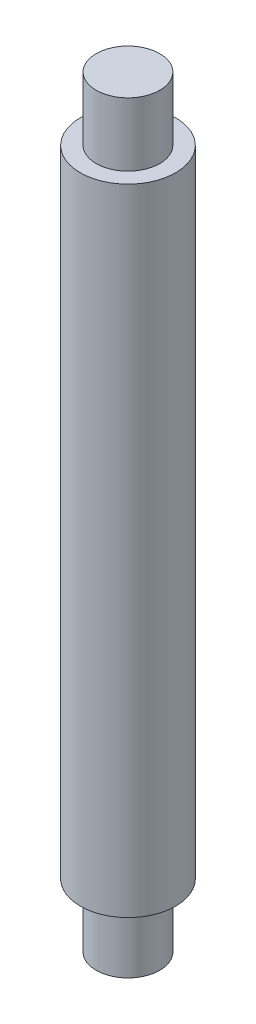
ISO-10303-21;
HEADER;
FILE_DESCRIPTION(('STEP AP214'),'2;1');
FILE_NAME('part.step','',(''),(''),'','','');
FILE_SCHEMA(('AUTOMOTIVE_DESIGN { 1 0 10303 214 1 1 1 1 }'));
ENDSEC;
DATA;
#1=APPLICATION_CONTEXT('core data for automotive mechanical design processes');
#2=APPLICATION_PROTOCOL_DEFINITION('international standard','automotive_design',2000,#1);
#3=PRODUCT_CONTEXT('',#1,'mechanical');
#4=PRODUCT('Part','Part','',(#3));
#5=PRODUCT_RELATED_PRODUCT_CATEGORY('part','',(#4));
#6=PRODUCT_DEFINITION_FORMATION('','',#4);
#7=PRODUCT_DEFINITION_CONTEXT('part definition',#1,'design');
#8=PRODUCT_DEFINITION('design','',#6,#7);
#9=PRODUCT_DEFINITION_SHAPE('','',#8);
#10=(LENGTH_UNIT() NAMED_UNIT(*) SI_UNIT(.MILLI.,.METRE.));
#11=(NAMED_UNIT(*) PLANE_ANGLE_UNIT() SI_UNIT($,.RADIAN.));
#12=(NAMED_UNIT(*) SI_UNIT($,.STERADIAN.) SOLID_ANGLE_UNIT());
#13=UNCERTAINTY_MEASURE_WITH_UNIT(LENGTH_MEASURE(1.E-05),#10,'distance_accuracy_value','');
#14=(GEOMETRIC_REPRESENTATION_CONTEXT(3) GLOBAL_UNCERTAINTY_ASSIGNED_CONTEXT((#13)) GLOBAL_UNIT_ASSIGNED_CONTEXT((#10,
#11,#12)) REPRESENTATION_CONTEXT('',''));
#15=CARTESIAN_POINT('',(0.,0.,0.));
#16=DIRECTION('',(0.,0.,1.));
#17=DIRECTION('',(1.,0.,0.));
#18=AXIS2_PLACEMENT_3D('',#15,#16,#17);
#19=CARTESIAN_POINT('',(0.,40.,0.));
#20=DIRECTION('',(0.,-1.,0.));
#21=DIRECTION('',(0.,0.,-1.));
#22=AXIS2_PLACEMENT_3D('',#19,#20,#21);
#23=CYLINDRICAL_SURFACE('',#22,3.);
#24=CARTESIAN_POINT('',(0.,40.,0.));
#25=DIRECTION('',(0.,1.,0.));
#26=DIRECTION('',(0.,0.,1.));
#27=AXIS2_PLACEMENT_3D('',#24,#25,#26);
#28=CIRCLE('',#27,3.);
#29=CARTESIAN_POINT('',(0.,40.,3.));
#30=VERTEX_POINT('',#29);
#31=EDGE_CURVE('E42',#30,#30,#28,.T.);
#32=ORIENTED_EDGE('',*,*,#31,.F.);
#33=EDGE_LOOP('',(#32));
#34=FACE_BOUND('',#33,.T.);
#35=CARTESIAN_POINT('',(0.,0.,0.));
#36=DIRECTION('',(0.,1.,0.));
#37=DIRECTION('',(0.,0.,1.));
#38=AXIS2_PLACEMENT_3D('',#35,#36,#37);
#39=CIRCLE('',#38,3.);
#40=CARTESIAN_POINT('',(0.,0.,3.));
#41=VERTEX_POINT('',#40);
#42=EDGE_CURVE('E33',#41,#41,#39,.T.);
#43=ORIENTED_EDGE('',*,*,#42,.T.);
#44=EDGE_LOOP('',(#43));
#45=FACE_BOUND('',#44,.T.);
#46=ADVANCED_FACE('F30',(#34,#45),#23,.T.);
#47=CARTESIAN_POINT('',(0.,40.,0.));
#48=DIRECTION('',(0.,1.,0.));
#49=DIRECTION('',(0.,0.,1.));
#50=AXIS2_PLACEMENT_3D('',#47,#48,#49);
#51=PLANE('',#50);
#52=CARTESIAN_POINT('',(0.,40.,0.));
#53=DIRECTION('',(0.,1.,0.));
#54=DIRECTION('',(0.,0.,1.));
#55=AXIS2_PLACEMENT_3D('',#52,#53,#54);
#56=CIRCLE('',#55,2.);
#57=CARTESIAN_POINT('',(0.,40.,2.));
#58=VERTEX_POINT('',#57);
#59=EDGE_CURVE('E37',#58,#58,#56,.T.);
#60=ORIENTED_EDGE('',*,*,#59,.F.);
#61=EDGE_LOOP('',(#60));
#62=FACE_BOUND('',#61,.T.);
#63=ORIENTED_EDGE('',*,*,#31,.T.);
#64=EDGE_LOOP('',(#63));
#65=FACE_BOUND('',#64,.T.);
#66=ADVANCED_FACE('F59',(#62,#65),#51,.T.);
#67=CARTESIAN_POINT('',(0.,0.,0.));
#68=DIRECTION('',(0.,1.,0.));
#69=DIRECTION('',(0.,0.,1.));
#70=AXIS2_PLACEMENT_3D('',#67,#68,#69);
#71=PLANE('',#70);
#72=CARTESIAN_POINT('',(0.,0.,0.));
#73=DIRECTION('',(0.,-1.,0.));
#74=DIRECTION('',(0.,0.,-1.));
#75=AXIS2_PLACEMENT_3D('',#72,#73,#74);
#76=CIRCLE('',#75,2.0000061226677);
#77=CARTESIAN_POINT('',(0.,0.,-2.0000061226677));
#78=VERTEX_POINT('',#77);
#79=EDGE_CURVE('E10',#78,#78,#76,.T.);
#80=ORIENTED_EDGE('',*,*,#79,.F.);
#81=EDGE_LOOP('',(#80));
#82=FACE_BOUND('',#81,.T.);
#83=ORIENTED_EDGE('',*,*,#42,.F.);
#84=EDGE_LOOP('',(#83));
#85=FACE_BOUND('',#84,.T.);
#86=ADVANCED_FACE('F56',(#82,#85),#71,.F.);
#87=CARTESIAN_POINT('',(0.,44.,0.));
#88=DIRECTION('',(0.,-1.,0.));
#89=DIRECTION('',(0.,0.,-1.));
#90=AXIS2_PLACEMENT_3D('',#87,#88,#89);
#91=CYLINDRICAL_SURFACE('',#90,2.);
#92=CARTESIAN_POINT('',(0.,44.,0.));
#93=DIRECTION('',(0.,1.,0.));
#94=DIRECTION('',(0.,0.,1.));
#95=AXIS2_PLACEMENT_3D('',#92,#93,#94);
#96=CIRCLE('',#95,2.);
#97=CARTESIAN_POINT('',(0.,44.,2.));
#98=VERTEX_POINT('',#97);
#99=EDGE_CURVE('E47',#98,#98,#96,.T.);
#100=ORIENTED_EDGE('',*,*,#99,.F.);
#101=EDGE_LOOP('',(#100));
#102=FACE_BOUND('',#101,.T.);
#103=ORIENTED_EDGE('',*,*,#59,.T.);
#104=EDGE_LOOP('',(#103));
#105=FACE_BOUND('',#104,.T.);
#106=ADVANCED_FACE('F58',(#102,#105),#91,.T.);
#107=CARTESIAN_POINT('',(0.,44.,0.));
#108=DIRECTION('',(0.,1.,0.));
#109=DIRECTION('',(0.,0.,1.));
#110=AXIS2_PLACEMENT_3D('',#107,#108,#109);
#111=PLANE('',#110);
#112=ORIENTED_EDGE('',*,*,#99,.T.);
#113=EDGE_LOOP('',(#112));
#114=FACE_BOUND('',#113,.T.);
#115=ADVANCED_FACE('F65',(#114),#111,.T.);
#116=CARTESIAN_POINT('',(0.,-4.,0.));
#117=DIRECTION('',(0.,1.,0.));
#118=DIRECTION('',(0.,0.,1.));
#119=AXIS2_PLACEMENT_3D('',#116,#117,#118);
#120=CYLINDRICAL_SURFACE('',#119,2.0000061226677);
#121=CARTESIAN_POINT('',(0.,-4.,0.));
#122=DIRECTION('',(0.,-1.,0.));
#123=DIRECTION('',(0.,0.,-1.));
#124=AXIS2_PLACEMENT_3D('',#121,#122,#123);
#125=CIRCLE('',#124,2.0000061226677);
#126=CARTESIAN_POINT('',(0.,-4.,-2.0000061226677));
#127=VERTEX_POINT('',#126);
#128=EDGE_CURVE('E46',#127,#127,#125,.T.);
#129=ORIENTED_EDGE('',*,*,#128,.F.);
#130=EDGE_LOOP('',(#129));
#131=FACE_BOUND('',#130,.T.);
#132=ORIENTED_EDGE('',*,*,#79,.T.);
#133=EDGE_LOOP('',(#132));
#134=FACE_BOUND('',#133,.T.);
#135=ADVANCED_FACE('F93',(#131,#134),#120,.T.);
#136=CARTESIAN_POINT('',(0.,-4.,0.));
#137=DIRECTION('',(0.,-1.,0.));
#138=DIRECTION('',(0.,0.,-1.));
#139=AXIS2_PLACEMENT_3D('',#136,#137,#138);
#140=PLANE('',#139);
#141=ORIENTED_EDGE('',*,*,#128,.T.);
#142=EDGE_LOOP('',(#141));
#143=FACE_BOUND('',#142,.T.);
#144=ADVANCED_FACE('F107',(#143),#140,.T.);
#145=CLOSED_SHELL('',(#46,#66,#86,#106,#115,#135,#144));
#146=MANIFOLD_SOLID_BREP('B2',#145);
#147=ADVANCED_BREP_SHAPE_REPRESENTATION('',(#18,#146),#14);
#148=SHAPE_DEFINITION_REPRESENTATION(#9,#147);
ENDSEC;
END-ISO-10303-21;
